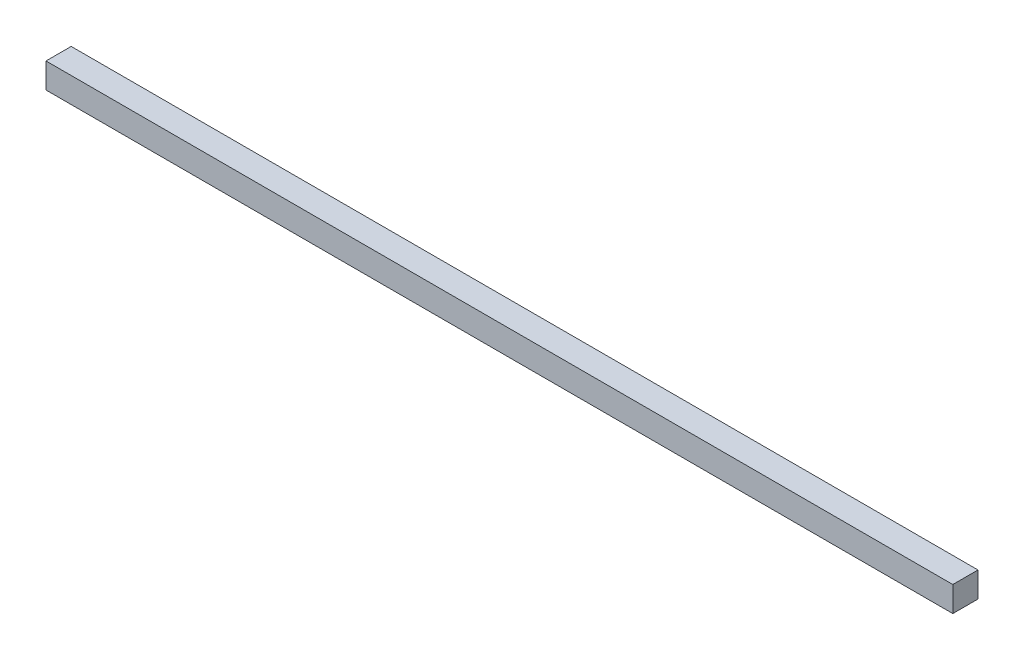
ISO-10303-21;
HEADER;
FILE_DESCRIPTION(('STEP AP214'),'2;1');
FILE_NAME('part.step','',(''),(''),'','','');
FILE_SCHEMA(('AUTOMOTIVE_DESIGN { 1 0 10303 214 1 1 1 1 }'));
ENDSEC;
DATA;
#1=APPLICATION_CONTEXT('core data for automotive mechanical design processes');
#2=APPLICATION_PROTOCOL_DEFINITION('international standard','automotive_design',2000,#1);
#3=PRODUCT_CONTEXT('',#1,'mechanical');
#4=PRODUCT('Part','Part','',(#3));
#5=PRODUCT_RELATED_PRODUCT_CATEGORY('part','',(#4));
#6=PRODUCT_DEFINITION_FORMATION('','',#4);
#7=PRODUCT_DEFINITION_CONTEXT('part definition',#1,'design');
#8=PRODUCT_DEFINITION('design','',#6,#7);
#9=PRODUCT_DEFINITION_SHAPE('','',#8);
#10=(LENGTH_UNIT() NAMED_UNIT(*) SI_UNIT(.MILLI.,.METRE.));
#11=(NAMED_UNIT(*) PLANE_ANGLE_UNIT() SI_UNIT($,.RADIAN.));
#12=(NAMED_UNIT(*) SI_UNIT($,.STERADIAN.) SOLID_ANGLE_UNIT());
#13=UNCERTAINTY_MEASURE_WITH_UNIT(LENGTH_MEASURE(1.E-05),#10,'distance_accuracy_value','');
#14=(GEOMETRIC_REPRESENTATION_CONTEXT(3) GLOBAL_UNCERTAINTY_ASSIGNED_CONTEXT((#13)) GLOBAL_UNIT_ASSIGNED_CONTEXT((#10,
#11,#12)) REPRESENTATION_CONTEXT('',''));
#15=CARTESIAN_POINT('',(0.,0.,0.));
#16=DIRECTION('',(0.,0.,1.));
#17=DIRECTION('',(1.,0.,0.));
#18=AXIS2_PLACEMENT_3D('',#15,#16,#17);
#19=CARTESIAN_POINT('',(-82.1515602948095,9.97857142857143,5.));
#20=DIRECTION('',(1.,0.,0.));
#21=DIRECTION('',(0.,0.,-1.));
#22=AXIS2_PLACEMENT_3D('',#19,#20,#21);
#23=PLANE('',#22);
#24=DIRECTION('',(0.,-1.,0.));
#25=VECTOR('',#24,1.);
#26=CARTESIAN_POINT('',(-82.1515602948095,9.97857142857143,0.));
#27=LINE('',#26,#25);
#28=CARTESIAN_POINT('',(-82.1515602948095,9.97857142857143,0.));
#29=VERTEX_POINT('',#28);
#30=CARTESIAN_POINT('',(-82.1515602948095,4.97857142857143,0.));
#31=VERTEX_POINT('',#30);
#32=EDGE_CURVE('E96',#29,#31,#27,.T.);
#33=ORIENTED_EDGE('',*,*,#32,.T.);
#34=DIRECTION('',(0.,0.,-1.));
#35=VECTOR('',#34,1.);
#36=CARTESIAN_POINT('',(-82.1515602948095,4.97857142857143,5.));
#37=LINE('',#36,#35);
#38=CARTESIAN_POINT('',(-82.1515602948095,4.97857142857143,5.));
#39=VERTEX_POINT('',#38);
#40=EDGE_CURVE('E11',#39,#31,#37,.T.);
#41=ORIENTED_EDGE('',*,*,#40,.F.);
#42=DIRECTION('',(0.,-1.,0.));
#43=VECTOR('',#42,1.);
#44=CARTESIAN_POINT('',(-82.1515602948095,9.97857142857143,5.));
#45=LINE('',#44,#43);
#46=CARTESIAN_POINT('',(-82.1515602948095,9.97857142857143,5.));
#47=VERTEX_POINT('',#46);
#48=EDGE_CURVE('E84',#47,#39,#45,.T.);
#49=ORIENTED_EDGE('',*,*,#48,.F.);
#50=DIRECTION('',(0.,0.,-1.));
#51=VECTOR('',#50,1.);
#52=CARTESIAN_POINT('',(-82.1515602948095,9.97857142857143,5.));
#53=LINE('',#52,#51);
#54=EDGE_CURVE('E92',#47,#29,#53,.T.);
#55=ORIENTED_EDGE('',*,*,#54,.T.);
#56=EDGE_LOOP('',(#33,#41,#49,#55));
#57=FACE_BOUND('',#56,.T.);
#58=ADVANCED_FACE('F33',(#57),#23,.F.);
#59=CARTESIAN_POINT('',(-82.1515602948095,4.97857142857143,5.));
#60=DIRECTION('',(0.,1.,0.));
#61=DIRECTION('',(-1.,0.,0.));
#62=AXIS2_PLACEMENT_3D('',#59,#60,#61);
#63=PLANE('',#62);
#64=DIRECTION('',(1.,0.,0.));
#65=VECTOR('',#64,1.);
#66=CARTESIAN_POINT('',(-82.1515602948095,4.97857142857143,0.));
#67=LINE('',#66,#65);
#68=CARTESIAN_POINT('',(97.8484397051905,4.97857142857143,0.));
#69=VERTEX_POINT('',#68);
#70=EDGE_CURVE('E88',#31,#69,#67,.T.);
#71=ORIENTED_EDGE('',*,*,#70,.T.);
#72=DIRECTION('',(0.,0.,-1.));
#73=VECTOR('',#72,1.);
#74=CARTESIAN_POINT('',(97.8484397051905,4.97857142857143,5.));
#75=LINE('',#74,#73);
#76=CARTESIAN_POINT('',(97.8484397051905,4.97857142857143,5.));
#77=VERTEX_POINT('',#76);
#78=EDGE_CURVE('E41',#77,#69,#75,.T.);
#79=ORIENTED_EDGE('',*,*,#78,.F.);
#80=DIRECTION('',(1.,0.,0.));
#81=VECTOR('',#80,1.);
#82=CARTESIAN_POINT('',(-82.1515602948095,4.97857142857143,5.));
#83=LINE('',#82,#81);
#84=EDGE_CURVE('E79',#39,#77,#83,.T.);
#85=ORIENTED_EDGE('',*,*,#84,.F.);
#86=ORIENTED_EDGE('',*,*,#40,.T.);
#87=EDGE_LOOP('',(#71,#79,#85,#86));
#88=FACE_BOUND('',#87,.T.);
#89=ADVANCED_FACE('F87',(#88),#63,.F.);
#90=CARTESIAN_POINT('',(97.8484397051905,9.97857142857143,5.));
#91=DIRECTION('',(-1.,0.,0.));
#92=DIRECTION('',(0.,0.,1.));
#93=AXIS2_PLACEMENT_3D('',#90,#91,#92);
#94=PLANE('',#93);
#95=DIRECTION('',(0.,1.,0.));
#96=VECTOR('',#95,1.);
#97=CARTESIAN_POINT('',(97.8484397051905,9.97857142857143,0.));
#98=LINE('',#97,#96);
#99=CARTESIAN_POINT('',(97.8484397051905,9.97857142857143,0.));
#100=VERTEX_POINT('',#99);
#101=EDGE_CURVE('E66',#69,#100,#98,.T.);
#102=ORIENTED_EDGE('',*,*,#101,.T.);
#103=DIRECTION('',(0.,0.,-1.));
#104=VECTOR('',#103,1.);
#105=CARTESIAN_POINT('',(97.8484397051905,9.97857142857143,5.));
#106=LINE('',#105,#104);
#107=CARTESIAN_POINT('',(97.8484397051905,9.97857142857143,5.));
#108=VERTEX_POINT('',#107);
#109=EDGE_CURVE('E89',#108,#100,#106,.T.);
#110=ORIENTED_EDGE('',*,*,#109,.F.);
#111=DIRECTION('',(0.,1.,0.));
#112=VECTOR('',#111,1.);
#113=CARTESIAN_POINT('',(97.8484397051905,9.97857142857143,5.));
#114=LINE('',#113,#112);
#115=EDGE_CURVE('E82',#77,#108,#114,.T.);
#116=ORIENTED_EDGE('',*,*,#115,.F.);
#117=ORIENTED_EDGE('',*,*,#78,.T.);
#118=EDGE_LOOP('',(#102,#110,#116,#117));
#119=FACE_BOUND('',#118,.T.);
#120=ADVANCED_FACE('F90',(#119),#94,.F.);
#121=CARTESIAN_POINT('',(-82.1515602948095,9.97857142857143,5.));
#122=DIRECTION('',(0.,-1.,0.));
#123=DIRECTION('',(0.,0.,-1.));
#124=AXIS2_PLACEMENT_3D('',#121,#122,#123);
#125=PLANE('',#124);
#126=DIRECTION('',(-1.,0.,0.));
#127=VECTOR('',#126,1.);
#128=CARTESIAN_POINT('',(-82.1515602948095,9.97857142857143,0.));
#129=LINE('',#128,#127);
#130=EDGE_CURVE('E72',#100,#29,#129,.T.);
#131=ORIENTED_EDGE('',*,*,#130,.T.);
#132=ORIENTED_EDGE('',*,*,#54,.F.);
#133=DIRECTION('',(-1.,0.,0.));
#134=VECTOR('',#133,1.);
#135=CARTESIAN_POINT('',(-82.1515602948095,9.97857142857143,5.));
#136=LINE('',#135,#134);
#137=EDGE_CURVE('E49',#108,#47,#136,.T.);
#138=ORIENTED_EDGE('',*,*,#137,.F.);
#139=ORIENTED_EDGE('',*,*,#109,.T.);
#140=EDGE_LOOP('',(#131,#132,#138,#139));
#141=FACE_BOUND('',#140,.T.);
#142=ADVANCED_FACE('F103',(#141),#125,.F.);
#143=CARTESIAN_POINT('',(0.,0.,5.));
#144=DIRECTION('',(0.,0.,1.));
#145=DIRECTION('',(1.,0.,0.));
#146=AXIS2_PLACEMENT_3D('',#143,#144,#145);
#147=PLANE('',#146);
#148=ORIENTED_EDGE('',*,*,#48,.T.);
#149=ORIENTED_EDGE('',*,*,#84,.T.);
#150=ORIENTED_EDGE('',*,*,#115,.T.);
#151=ORIENTED_EDGE('',*,*,#137,.T.);
#152=EDGE_LOOP('',(#148,#149,#150,#151));
#153=FACE_BOUND('',#152,.T.);
#154=ADVANCED_FACE('F80',(#153),#147,.T.);
#155=CARTESIAN_POINT('',(0.,0.,0.));
#156=DIRECTION('',(0.,0.,1.));
#157=DIRECTION('',(1.,0.,0.));
#158=AXIS2_PLACEMENT_3D('',#155,#156,#157);
#159=PLANE('',#158);
#160=ORIENTED_EDGE('',*,*,#32,.F.);
#161=ORIENTED_EDGE('',*,*,#130,.F.);
#162=ORIENTED_EDGE('',*,*,#101,.F.);
#163=ORIENTED_EDGE('',*,*,#70,.F.);
#164=EDGE_LOOP('',(#160,#161,#162,#163));
#165=FACE_BOUND('',#164,.T.);
#166=ADVANCED_FACE('F106',(#165),#159,.F.);
#167=CLOSED_SHELL('',(#58,#89,#120,#142,#154,#166));
#168=MANIFOLD_SOLID_BREP('B2',#167);
#169=ADVANCED_BREP_SHAPE_REPRESENTATION('',(#18,#168),#14);
#170=SHAPE_DEFINITION_REPRESENTATION(#9,#169);
ENDSEC;
END-ISO-10303-21;
